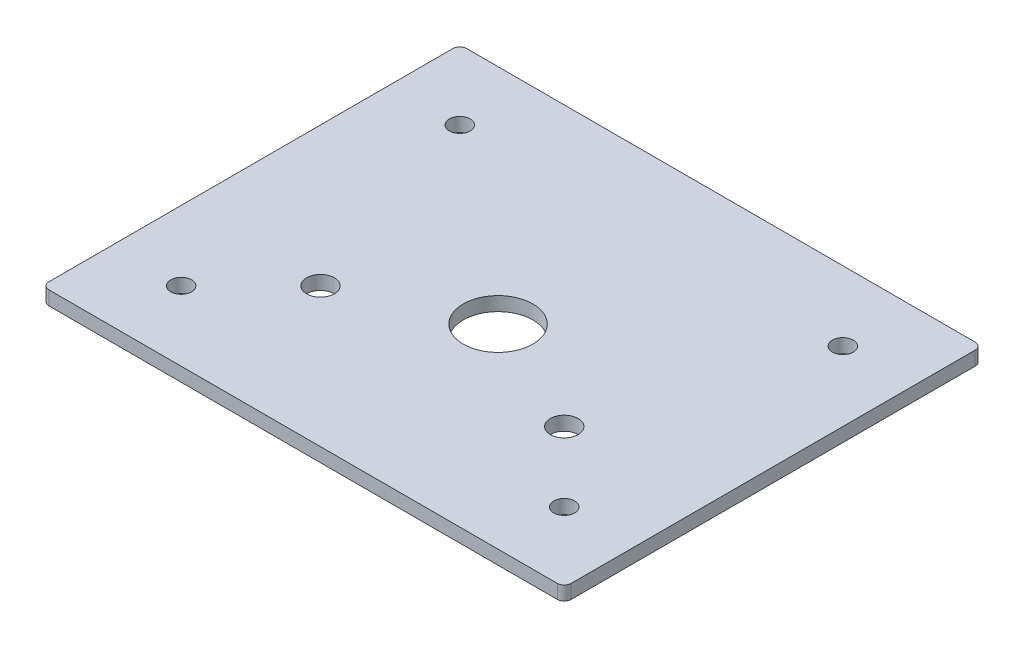
ISO-10303-21;
HEADER;
FILE_DESCRIPTION(('STEP AP214'),'2;1');
FILE_NAME('part.step','',(''),(''),'','','');
FILE_SCHEMA(('AUTOMOTIVE_DESIGN { 1 0 10303 214 1 1 1 1 }'));
ENDSEC;
DATA;
#1=APPLICATION_CONTEXT('core data for automotive mechanical design processes');
#2=APPLICATION_PROTOCOL_DEFINITION('international standard','automotive_design',2000,#1);
#3=PRODUCT_CONTEXT('',#1,'mechanical');
#4=PRODUCT('Part','Part','',(#3));
#5=PRODUCT_RELATED_PRODUCT_CATEGORY('part','',(#4));
#6=PRODUCT_DEFINITION_FORMATION('','',#4);
#7=PRODUCT_DEFINITION_CONTEXT('part definition',#1,'design');
#8=PRODUCT_DEFINITION('design','',#6,#7);
#9=PRODUCT_DEFINITION_SHAPE('','',#8);
#10=(LENGTH_UNIT() NAMED_UNIT(*) SI_UNIT(.MILLI.,.METRE.));
#11=(NAMED_UNIT(*) PLANE_ANGLE_UNIT() SI_UNIT($,.RADIAN.));
#12=(NAMED_UNIT(*) SI_UNIT($,.STERADIAN.) SOLID_ANGLE_UNIT());
#13=UNCERTAINTY_MEASURE_WITH_UNIT(LENGTH_MEASURE(1.E-05),#10,'distance_accuracy_value','');
#14=(GEOMETRIC_REPRESENTATION_CONTEXT(3) GLOBAL_UNCERTAINTY_ASSIGNED_CONTEXT((#13)) GLOBAL_UNIT_ASSIGNED_CONTEXT((#10,
#11,#12)) REPRESENTATION_CONTEXT('',''));
#15=CARTESIAN_POINT('',(0.,0.,0.));
#16=DIRECTION('',(0.,0.,1.));
#17=DIRECTION('',(1.,0.,0.));
#18=AXIS2_PLACEMENT_3D('',#15,#16,#17);
#19=CARTESIAN_POINT('',(0.,2.,0.));
#20=DIRECTION('',(1.,0.,0.));
#21=DIRECTION('',(0.,0.,-1.));
#22=AXIS2_PLACEMENT_3D('',#19,#20,#21);
#23=PLANE('',#22);
#24=DIRECTION('',(0.,0.,1.));
#25=VECTOR('',#24,1.);
#26=CARTESIAN_POINT('',(0.,0.,0.));
#27=LINE('',#26,#25);
#28=CARTESIAN_POINT('',(0.,0.,-59.));
#29=VERTEX_POINT('',#28);
#30=CARTESIAN_POINT('',(0.,0.,-1.));
#31=VERTEX_POINT('',#30);
#32=EDGE_CURVE('E162',#29,#31,#27,.T.);
#33=ORIENTED_EDGE('',*,*,#32,.T.);
#34=DIRECTION('',(0.,-1.,0.));
#35=VECTOR('',#34,1.);
#36=CARTESIAN_POINT('',(0.,2.,-1.));
#37=LINE('',#36,#35);
#38=CARTESIAN_POINT('',(0.,2.,-1.));
#39=VERTEX_POINT('',#38);
#40=EDGE_CURVE('E11',#31,#39,#37,.F.);
#41=ORIENTED_EDGE('',*,*,#40,.T.);
#42=DIRECTION('',(0.,0.,1.));
#43=VECTOR('',#42,1.);
#44=CARTESIAN_POINT('',(0.,2.,0.));
#45=LINE('',#44,#43);
#46=CARTESIAN_POINT('',(0.,2.,-59.));
#47=VERTEX_POINT('',#46);
#48=EDGE_CURVE('E125',#47,#39,#45,.T.);
#49=ORIENTED_EDGE('',*,*,#48,.F.);
#50=DIRECTION('',(0.,-1.,0.));
#51=VECTOR('',#50,1.);
#52=CARTESIAN_POINT('',(0.,2.,-59.));
#53=LINE('',#52,#51);
#54=EDGE_CURVE('E41',#47,#29,#53,.T.);
#55=ORIENTED_EDGE('',*,*,#54,.T.);
#56=EDGE_LOOP('',(#33,#41,#49,#55));
#57=FACE_BOUND('',#56,.T.);
#58=ADVANCED_FACE('F33',(#57),#23,.F.);
#59=CARTESIAN_POINT('',(0.,2.,0.));
#60=DIRECTION('',(0.,0.,-1.));
#61=DIRECTION('',(-1.,0.,0.));
#62=AXIS2_PLACEMENT_3D('',#59,#60,#61);
#63=PLANE('',#62);
#64=DIRECTION('',(1.,0.,0.));
#65=VECTOR('',#64,1.);
#66=CARTESIAN_POINT('',(0.,0.,0.));
#67=LINE('',#66,#65);
#68=CARTESIAN_POINT('',(1.,0.,0.));
#69=VERTEX_POINT('',#68);
#70=CARTESIAN_POINT('',(74.,0.,0.));
#71=VERTEX_POINT('',#70);
#72=EDGE_CURVE('E130',#69,#71,#67,.T.);
#73=ORIENTED_EDGE('',*,*,#72,.T.);
#74=DIRECTION('',(0.,-1.,0.));
#75=VECTOR('',#74,1.);
#76=CARTESIAN_POINT('',(74.,2.,0.));
#77=LINE('',#76,#75);
#78=CARTESIAN_POINT('',(74.,2.,0.));
#79=VERTEX_POINT('',#78);
#80=EDGE_CURVE('E48',#71,#79,#77,.F.);
#81=ORIENTED_EDGE('',*,*,#80,.T.);
#82=DIRECTION('',(1.,0.,0.));
#83=VECTOR('',#82,1.);
#84=CARTESIAN_POINT('',(0.,2.,0.));
#85=LINE('',#84,#83);
#86=CARTESIAN_POINT('',(1.,2.,0.));
#87=VERTEX_POINT('',#86);
#88=EDGE_CURVE('E128',#87,#79,#85,.T.);
#89=ORIENTED_EDGE('',*,*,#88,.F.);
#90=DIRECTION('',(0.,-1.,0.));
#91=VECTOR('',#90,1.);
#92=CARTESIAN_POINT('',(1.,2.,0.));
#93=LINE('',#92,#91);
#94=EDGE_CURVE('E154',#87,#69,#93,.T.);
#95=ORIENTED_EDGE('',*,*,#94,.T.);
#96=EDGE_LOOP('',(#73,#81,#89,#95));
#97=FACE_BOUND('',#96,.T.);
#98=ADVANCED_FACE('F236',(#97),#63,.F.);
#99=CARTESIAN_POINT('',(75.,2.,0.));
#100=DIRECTION('',(-1.,0.,0.));
#101=DIRECTION('',(0.,0.,1.));
#102=AXIS2_PLACEMENT_3D('',#99,#100,#101);
#103=PLANE('',#102);
#104=DIRECTION('',(0.,0.,-1.));
#105=VECTOR('',#104,1.);
#106=CARTESIAN_POINT('',(75.,0.,0.));
#107=LINE('',#106,#105);
#108=CARTESIAN_POINT('',(75.,0.,-1.));
#109=VERTEX_POINT('',#108);
#110=CARTESIAN_POINT('',(75.,0.,-59.));
#111=VERTEX_POINT('',#110);
#112=EDGE_CURVE('E126',#109,#111,#107,.T.);
#113=ORIENTED_EDGE('',*,*,#112,.T.);
#114=DIRECTION('',(0.,-1.,0.));
#115=VECTOR('',#114,1.);
#116=CARTESIAN_POINT('',(75.,2.,-59.));
#117=LINE('',#116,#115);
#118=CARTESIAN_POINT('',(75.,2.,-59.));
#119=VERTEX_POINT('',#118);
#120=EDGE_CURVE('E104',#111,#119,#117,.F.);
#121=ORIENTED_EDGE('',*,*,#120,.T.);
#122=DIRECTION('',(0.,0.,-1.));
#123=VECTOR('',#122,1.);
#124=CARTESIAN_POINT('',(75.,2.,0.));
#125=LINE('',#124,#123);
#126=CARTESIAN_POINT('',(75.,2.,-1.));
#127=VERTEX_POINT('',#126);
#128=EDGE_CURVE('E174',#127,#119,#125,.T.);
#129=ORIENTED_EDGE('',*,*,#128,.F.);
#130=DIRECTION('',(0.,-1.,0.));
#131=VECTOR('',#130,1.);
#132=CARTESIAN_POINT('',(75.,2.,-1.));
#133=LINE('',#132,#131);
#134=EDGE_CURVE('E109',#127,#109,#133,.T.);
#135=ORIENTED_EDGE('',*,*,#134,.T.);
#136=EDGE_LOOP('',(#113,#121,#129,#135));
#137=FACE_BOUND('',#136,.T.);
#138=ADVANCED_FACE('F233',(#137),#103,.F.);
#139=CARTESIAN_POINT('',(0.,2.,-60.));
#140=DIRECTION('',(0.,0.,1.));
#141=DIRECTION('',(1.,0.,0.));
#142=AXIS2_PLACEMENT_3D('',#139,#140,#141);
#143=PLANE('',#142);
#144=DIRECTION('',(-1.,0.,0.));
#145=VECTOR('',#144,1.);
#146=CARTESIAN_POINT('',(0.,2.,-60.));
#147=LINE('',#146,#145);
#148=CARTESIAN_POINT('',(74.,2.,-60.));
#149=VERTEX_POINT('',#148);
#150=CARTESIAN_POINT('',(1.,2.,-60.));
#151=VERTEX_POINT('',#150);
#152=EDGE_CURVE('E119',#149,#151,#147,.T.);
#153=ORIENTED_EDGE('',*,*,#152,.F.);
#154=DIRECTION('',(0.,-1.,0.));
#155=VECTOR('',#154,1.);
#156=CARTESIAN_POINT('',(74.,2.,-60.));
#157=LINE('',#156,#155);
#158=CARTESIAN_POINT('',(74.,0.,-60.));
#159=VERTEX_POINT('',#158);
#160=EDGE_CURVE('E103',#149,#159,#157,.T.);
#161=ORIENTED_EDGE('',*,*,#160,.T.);
#162=DIRECTION('',(-1.,0.,0.));
#163=VECTOR('',#162,1.);
#164=CARTESIAN_POINT('',(0.,0.,-60.));
#165=LINE('',#164,#163);
#166=CARTESIAN_POINT('',(1.,0.,-60.));
#167=VERTEX_POINT('',#166);
#168=EDGE_CURVE('E116',#159,#167,#165,.T.);
#169=ORIENTED_EDGE('',*,*,#168,.T.);
#170=DIRECTION('',(0.,-1.,0.));
#171=VECTOR('',#170,1.);
#172=CARTESIAN_POINT('',(1.,2.,-60.));
#173=LINE('',#172,#171);
#174=EDGE_CURVE('E121',#167,#151,#173,.F.);
#175=ORIENTED_EDGE('',*,*,#174,.T.);
#176=EDGE_LOOP('',(#153,#161,#169,#175));
#177=FACE_BOUND('',#176,.T.);
#178=ADVANCED_FACE('F115',(#177),#143,.F.);
#179=CARTESIAN_POINT('',(0.,2.,0.));
#180=DIRECTION('',(0.,-1.,0.));
#181=DIRECTION('',(0.,0.,-1.));
#182=AXIS2_PLACEMENT_3D('',#179,#180,#181);
#183=PLANE('',#182);
#184=CARTESIAN_POINT('',(37.5,2.,-28.));
#185=DIRECTION('',(0.,1.,0.));
#186=DIRECTION('',(0.,0.,1.));
#187=AXIS2_PLACEMENT_3D('',#184,#185,#186);
#188=CIRCLE('',#187,5.);
#189=CARTESIAN_POINT('',(37.5,2.,-23.));
#190=VERTEX_POINT('',#189);
#191=EDGE_CURVE('E138',#190,#190,#188,.T.);
#192=ORIENTED_EDGE('',*,*,#191,.F.);
#193=EDGE_LOOP('',(#192));
#194=FACE_BOUND('',#193,.T.);
#195=CARTESIAN_POINT('',(20.,2.,-20.));
#196=DIRECTION('',(0.,1.,0.));
#197=DIRECTION('',(0.,0.,1.));
#198=AXIS2_PLACEMENT_3D('',#195,#196,#197);
#199=CIRCLE('',#198,2.);
#200=CARTESIAN_POINT('',(20.,2.,-18.));
#201=VERTEX_POINT('',#200);
#202=EDGE_CURVE('E196',#201,#201,#199,.T.);
#203=ORIENTED_EDGE('',*,*,#202,.F.);
#204=EDGE_LOOP('',(#203));
#205=FACE_BOUND('',#204,.T.);
#206=CARTESIAN_POINT('',(65.,2.,-50.));
#207=DIRECTION('',(0.,1.,0.));
#208=DIRECTION('',(0.,0.,1.));
#209=AXIS2_PLACEMENT_3D('',#206,#207,#208);
#210=CIRCLE('',#209,1.5);
#211=CARTESIAN_POINT('',(65.,2.,-48.5));
#212=VERTEX_POINT('',#211);
#213=EDGE_CURVE('E185',#212,#212,#210,.T.);
#214=ORIENTED_EDGE('',*,*,#213,.F.);
#215=EDGE_LOOP('',(#214));
#216=FACE_BOUND('',#215,.T.);
#217=CARTESIAN_POINT('',(10.,2.,-50.));
#218=DIRECTION('',(0.,1.,0.));
#219=DIRECTION('',(0.,0.,1.));
#220=AXIS2_PLACEMENT_3D('',#217,#218,#219);
#221=CIRCLE('',#220,1.5);
#222=CARTESIAN_POINT('',(10.,2.,-48.5));
#223=VERTEX_POINT('',#222);
#224=EDGE_CURVE('E184',#223,#223,#221,.T.);
#225=ORIENTED_EDGE('',*,*,#224,.F.);
#226=EDGE_LOOP('',(#225));
#227=FACE_BOUND('',#226,.T.);
#228=CARTESIAN_POINT('',(65.,2.,-10.));
#229=DIRECTION('',(0.,1.,0.));
#230=DIRECTION('',(0.,0.,1.));
#231=AXIS2_PLACEMENT_3D('',#228,#229,#230);
#232=CIRCLE('',#231,1.5);
#233=CARTESIAN_POINT('',(65.,2.,-8.5));
#234=VERTEX_POINT('',#233);
#235=EDGE_CURVE('E179',#234,#234,#232,.T.);
#236=ORIENTED_EDGE('',*,*,#235,.F.);
#237=EDGE_LOOP('',(#236));
#238=FACE_BOUND('',#237,.T.);
#239=CARTESIAN_POINT('',(55.,2.,-20.));
#240=DIRECTION('',(0.,1.,0.));
#241=DIRECTION('',(0.,0.,1.));
#242=AXIS2_PLACEMENT_3D('',#239,#240,#241);
#243=CIRCLE('',#242,2.);
#244=CARTESIAN_POINT('',(55.,2.,-18.));
#245=VERTEX_POINT('',#244);
#246=EDGE_CURVE('E197',#245,#245,#243,.T.);
#247=ORIENTED_EDGE('',*,*,#246,.F.);
#248=EDGE_LOOP('',(#247));
#249=FACE_BOUND('',#248,.T.);
#250=CARTESIAN_POINT('',(10.,2.,-10.));
#251=DIRECTION('',(0.,1.,0.));
#252=DIRECTION('',(0.,0.,1.));
#253=AXIS2_PLACEMENT_3D('',#250,#251,#252);
#254=CIRCLE('',#253,1.5);
#255=CARTESIAN_POINT('',(10.,2.,-8.5));
#256=VERTEX_POINT('',#255);
#257=EDGE_CURVE('E170',#256,#256,#254,.T.);
#258=ORIENTED_EDGE('',*,*,#257,.F.);
#259=EDGE_LOOP('',(#258));
#260=FACE_BOUND('',#259,.T.);
#261=ORIENTED_EDGE('',*,*,#128,.T.);
#262=CARTESIAN_POINT('',(74.,2.,-59.));
#263=DIRECTION('',(0.,-1.,0.));
#264=DIRECTION('',(0.,0.,-1.));
#265=AXIS2_PLACEMENT_3D('',#262,#263,#264);
#266=CIRCLE('',#265,1.);
#267=EDGE_CURVE('E152',#119,#149,#266,.F.);
#268=ORIENTED_EDGE('',*,*,#267,.T.);
#269=ORIENTED_EDGE('',*,*,#152,.T.);
#270=CARTESIAN_POINT('',(1.,2.,-59.));
#271=DIRECTION('',(0.,-1.,0.));
#272=DIRECTION('',(0.,0.,-1.));
#273=AXIS2_PLACEMENT_3D('',#270,#271,#272);
#274=CIRCLE('',#273,1.);
#275=EDGE_CURVE('E147',#151,#47,#274,.F.);
#276=ORIENTED_EDGE('',*,*,#275,.T.);
#277=ORIENTED_EDGE('',*,*,#48,.T.);
#278=CARTESIAN_POINT('',(1.,2.,-1.));
#279=DIRECTION('',(0.,-1.,0.));
#280=DIRECTION('',(0.,0.,-1.));
#281=AXIS2_PLACEMENT_3D('',#278,#279,#280);
#282=CIRCLE('',#281,1.);
#283=EDGE_CURVE('E55',#39,#87,#282,.F.);
#284=ORIENTED_EDGE('',*,*,#283,.T.);
#285=ORIENTED_EDGE('',*,*,#88,.T.);
#286=CARTESIAN_POINT('',(74.,2.,-1.));
#287=DIRECTION('',(0.,-1.,0.));
#288=DIRECTION('',(0.,0.,-1.));
#289=AXIS2_PLACEMENT_3D('',#286,#287,#288);
#290=CIRCLE('',#289,1.);
#291=EDGE_CURVE('E150',#79,#127,#290,.F.);
#292=ORIENTED_EDGE('',*,*,#291,.T.);
#293=EDGE_LOOP('',(#261,#268,#269,#276,#277,#284,#285,#292));
#294=FACE_BOUND('',#293,.T.);
#295=ADVANCED_FACE('F214',(#194,#205,#216,#227,#238,#249,#260,#294),#183,.F.);
#296=CARTESIAN_POINT('',(0.,0.,0.));
#297=DIRECTION('',(0.,-1.,0.));
#298=DIRECTION('',(0.,0.,-1.));
#299=AXIS2_PLACEMENT_3D('',#296,#297,#298);
#300=PLANE('',#299);
#301=CARTESIAN_POINT('',(37.5,0.,-28.));
#302=DIRECTION('',(0.,-1.,0.));
#303=DIRECTION('',(0.,0.,-1.));
#304=AXIS2_PLACEMENT_3D('',#301,#302,#303);
#305=CIRCLE('',#304,5.);
#306=CARTESIAN_POINT('',(37.5,0.,-33.));
#307=VERTEX_POINT('',#306);
#308=EDGE_CURVE('E134',#307,#307,#305,.T.);
#309=ORIENTED_EDGE('',*,*,#308,.F.);
#310=EDGE_LOOP('',(#309));
#311=FACE_BOUND('',#310,.T.);
#312=CARTESIAN_POINT('',(20.,0.,-20.));
#313=DIRECTION('',(0.,1.,0.));
#314=DIRECTION('',(0.,0.,1.));
#315=AXIS2_PLACEMENT_3D('',#312,#313,#314);
#316=CIRCLE('',#315,2.);
#317=CARTESIAN_POINT('',(20.,0.,-18.));
#318=VERTEX_POINT('',#317);
#319=EDGE_CURVE('E193',#318,#318,#316,.T.);
#320=ORIENTED_EDGE('',*,*,#319,.T.);
#321=EDGE_LOOP('',(#320));
#322=FACE_BOUND('',#321,.T.);
#323=CARTESIAN_POINT('',(65.,0.,-50.));
#324=DIRECTION('',(0.,1.,0.));
#325=DIRECTION('',(0.,0.,1.));
#326=AXIS2_PLACEMENT_3D('',#323,#324,#325);
#327=CIRCLE('',#326,1.5);
#328=CARTESIAN_POINT('',(65.,0.,-48.5));
#329=VERTEX_POINT('',#328);
#330=EDGE_CURVE('E200',#329,#329,#327,.T.);
#331=ORIENTED_EDGE('',*,*,#330,.T.);
#332=EDGE_LOOP('',(#331));
#333=FACE_BOUND('',#332,.T.);
#334=CARTESIAN_POINT('',(10.,0.,-50.));
#335=DIRECTION('',(0.,1.,0.));
#336=DIRECTION('',(0.,0.,1.));
#337=AXIS2_PLACEMENT_3D('',#334,#335,#336);
#338=CIRCLE('',#337,1.5);
#339=CARTESIAN_POINT('',(10.,0.,-48.5));
#340=VERTEX_POINT('',#339);
#341=EDGE_CURVE('E181',#340,#340,#338,.T.);
#342=ORIENTED_EDGE('',*,*,#341,.T.);
#343=EDGE_LOOP('',(#342));
#344=FACE_BOUND('',#343,.T.);
#345=CARTESIAN_POINT('',(65.,0.,-10.));
#346=DIRECTION('',(0.,1.,0.));
#347=DIRECTION('',(0.,0.,1.));
#348=AXIS2_PLACEMENT_3D('',#345,#346,#347);
#349=CIRCLE('',#348,1.5);
#350=CARTESIAN_POINT('',(65.,0.,-8.5));
#351=VERTEX_POINT('',#350);
#352=EDGE_CURVE('E188',#351,#351,#349,.T.);
#353=ORIENTED_EDGE('',*,*,#352,.T.);
#354=EDGE_LOOP('',(#353));
#355=FACE_BOUND('',#354,.T.);
#356=CARTESIAN_POINT('',(55.,0.,-20.));
#357=DIRECTION('',(0.,1.,0.));
#358=DIRECTION('',(0.,0.,1.));
#359=AXIS2_PLACEMENT_3D('',#356,#357,#358);
#360=CIRCLE('',#359,2.);
#361=CARTESIAN_POINT('',(55.,0.,-18.));
#362=VERTEX_POINT('',#361);
#363=EDGE_CURVE('E137',#362,#362,#360,.T.);
#364=ORIENTED_EDGE('',*,*,#363,.T.);
#365=EDGE_LOOP('',(#364));
#366=FACE_BOUND('',#365,.T.);
#367=CARTESIAN_POINT('',(10.,0.,-10.));
#368=DIRECTION('',(0.,1.,0.));
#369=DIRECTION('',(0.,0.,1.));
#370=AXIS2_PLACEMENT_3D('',#367,#368,#369);
#371=CIRCLE('',#370,1.5);
#372=CARTESIAN_POINT('',(10.,0.,-8.5));
#373=VERTEX_POINT('',#372);
#374=EDGE_CURVE('E167',#373,#373,#371,.T.);
#375=ORIENTED_EDGE('',*,*,#374,.T.);
#376=EDGE_LOOP('',(#375));
#377=FACE_BOUND('',#376,.T.);
#378=ORIENTED_EDGE('',*,*,#168,.F.);
#379=CARTESIAN_POINT('',(74.,0.,-59.));
#380=DIRECTION('',(0.,-1.,0.));
#381=DIRECTION('',(0.,0.,-1.));
#382=AXIS2_PLACEMENT_3D('',#379,#380,#381);
#383=CIRCLE('',#382,1.);
#384=EDGE_CURVE('E99',#159,#111,#383,.T.);
#385=ORIENTED_EDGE('',*,*,#384,.T.);
#386=ORIENTED_EDGE('',*,*,#112,.F.);
#387=CARTESIAN_POINT('',(74.,0.,-1.));
#388=DIRECTION('',(0.,-1.,0.));
#389=DIRECTION('',(0.,0.,-1.));
#390=AXIS2_PLACEMENT_3D('',#387,#388,#389);
#391=CIRCLE('',#390,1.);
#392=EDGE_CURVE('E110',#109,#71,#391,.T.);
#393=ORIENTED_EDGE('',*,*,#392,.T.);
#394=ORIENTED_EDGE('',*,*,#72,.F.);
#395=CARTESIAN_POINT('',(1.,0.,-1.));
#396=DIRECTION('',(0.,-1.,0.));
#397=DIRECTION('',(0.,0.,-1.));
#398=AXIS2_PLACEMENT_3D('',#395,#396,#397);
#399=CIRCLE('',#398,1.);
#400=EDGE_CURVE('E141',#69,#31,#399,.T.);
#401=ORIENTED_EDGE('',*,*,#400,.T.);
#402=ORIENTED_EDGE('',*,*,#32,.F.);
#403=CARTESIAN_POINT('',(1.,0.,-59.));
#404=DIRECTION('',(0.,-1.,0.));
#405=DIRECTION('',(0.,0.,-1.));
#406=AXIS2_PLACEMENT_3D('',#403,#404,#405);
#407=CIRCLE('',#406,1.);
#408=EDGE_CURVE('E120',#29,#167,#407,.T.);
#409=ORIENTED_EDGE('',*,*,#408,.T.);
#410=EDGE_LOOP('',(#378,#385,#386,#393,#394,#401,#402,#409));
#411=FACE_BOUND('',#410,.T.);
#412=ADVANCED_FACE('F123',(#311,#322,#333,#344,#355,#366,#377,#411),#300,.T.);
#413=CARTESIAN_POINT('',(10.,0.,-10.));
#414=DIRECTION('',(0.,1.,0.));
#415=DIRECTION('',(0.,0.,1.));
#416=AXIS2_PLACEMENT_3D('',#413,#414,#415);
#417=CYLINDRICAL_SURFACE('',#416,1.5);
#418=ORIENTED_EDGE('',*,*,#374,.F.);
#419=EDGE_LOOP('',(#418));
#420=FACE_BOUND('',#419,.T.);
#421=ORIENTED_EDGE('',*,*,#257,.T.);
#422=EDGE_LOOP('',(#421));
#423=FACE_BOUND('',#422,.T.);
#424=ADVANCED_FACE('F329',(#420,#423),#417,.F.);
#425=CARTESIAN_POINT('',(55.,0.,-20.));
#426=DIRECTION('',(0.,1.,0.));
#427=DIRECTION('',(0.,0.,1.));
#428=AXIS2_PLACEMENT_3D('',#425,#426,#427);
#429=CYLINDRICAL_SURFACE('',#428,2.);
#430=ORIENTED_EDGE('',*,*,#363,.F.);
#431=EDGE_LOOP('',(#430));
#432=FACE_BOUND('',#431,.T.);
#433=ORIENTED_EDGE('',*,*,#246,.T.);
#434=EDGE_LOOP('',(#433));
#435=FACE_BOUND('',#434,.T.);
#436=ADVANCED_FACE('F320',(#432,#435),#429,.F.);
#437=CARTESIAN_POINT('',(65.,0.,-10.));
#438=DIRECTION('',(0.,1.,0.));
#439=DIRECTION('',(0.,0.,1.));
#440=AXIS2_PLACEMENT_3D('',#437,#438,#439);
#441=CYLINDRICAL_SURFACE('',#440,1.5);
#442=ORIENTED_EDGE('',*,*,#352,.F.);
#443=EDGE_LOOP('',(#442));
#444=FACE_BOUND('',#443,.T.);
#445=ORIENTED_EDGE('',*,*,#235,.T.);
#446=EDGE_LOOP('',(#445));
#447=FACE_BOUND('',#446,.T.);
#448=ADVANCED_FACE('F311',(#444,#447),#441,.F.);
#449=CARTESIAN_POINT('',(10.,0.,-50.));
#450=DIRECTION('',(0.,1.,0.));
#451=DIRECTION('',(0.,0.,1.));
#452=AXIS2_PLACEMENT_3D('',#449,#450,#451);
#453=CYLINDRICAL_SURFACE('',#452,1.5);
#454=ORIENTED_EDGE('',*,*,#341,.F.);
#455=EDGE_LOOP('',(#454));
#456=FACE_BOUND('',#455,.T.);
#457=ORIENTED_EDGE('',*,*,#224,.T.);
#458=EDGE_LOOP('',(#457));
#459=FACE_BOUND('',#458,.T.);
#460=ADVANCED_FACE('F302',(#456,#459),#453,.F.);
#461=CARTESIAN_POINT('',(65.,0.,-50.));
#462=DIRECTION('',(0.,1.,0.));
#463=DIRECTION('',(0.,0.,1.));
#464=AXIS2_PLACEMENT_3D('',#461,#462,#463);
#465=CYLINDRICAL_SURFACE('',#464,1.5);
#466=ORIENTED_EDGE('',*,*,#330,.F.);
#467=EDGE_LOOP('',(#466));
#468=FACE_BOUND('',#467,.T.);
#469=ORIENTED_EDGE('',*,*,#213,.T.);
#470=EDGE_LOOP('',(#469));
#471=FACE_BOUND('',#470,.T.);
#472=ADVANCED_FACE('F293',(#468,#471),#465,.F.);
#473=CARTESIAN_POINT('',(20.,0.,-20.));
#474=DIRECTION('',(0.,1.,0.));
#475=DIRECTION('',(0.,0.,1.));
#476=AXIS2_PLACEMENT_3D('',#473,#474,#475);
#477=CYLINDRICAL_SURFACE('',#476,2.);
#478=ORIENTED_EDGE('',*,*,#319,.F.);
#479=EDGE_LOOP('',(#478));
#480=FACE_BOUND('',#479,.T.);
#481=ORIENTED_EDGE('',*,*,#202,.T.);
#482=EDGE_LOOP('',(#481));
#483=FACE_BOUND('',#482,.T.);
#484=ADVANCED_FACE('F284',(#480,#483),#477,.F.);
#485=CARTESIAN_POINT('',(37.5,-38.,-28.));
#486=DIRECTION('',(0.,1.,0.));
#487=DIRECTION('',(0.,0.,1.));
#488=AXIS2_PLACEMENT_3D('',#485,#486,#487);
#489=CYLINDRICAL_SURFACE('',#488,5.);
#490=ORIENTED_EDGE('',*,*,#308,.T.);
#491=EDGE_LOOP('',(#490));
#492=FACE_BOUND('',#491,.T.);
#493=ORIENTED_EDGE('',*,*,#191,.T.);
#494=EDGE_LOOP('',(#493));
#495=FACE_BOUND('',#494,.T.);
#496=ADVANCED_FACE('F212',(#492,#495),#489,.F.);
#497=CARTESIAN_POINT('',(74.,2.,-59.));
#498=DIRECTION('',(0.,-1.,0.));
#499=DIRECTION('',(0.,0.,-1.));
#500=AXIS2_PLACEMENT_3D('',#497,#498,#499);
#501=CYLINDRICAL_SURFACE('',#500,1.);
#502=ORIENTED_EDGE('',*,*,#267,.F.);
#503=ORIENTED_EDGE('',*,*,#120,.F.);
#504=ORIENTED_EDGE('',*,*,#384,.F.);
#505=ORIENTED_EDGE('',*,*,#160,.F.);
#506=EDGE_LOOP('',(#502,#503,#504,#505));
#507=FACE_BOUND('',#506,.T.);
#508=ADVANCED_FACE('F102',(#507),#501,.T.);
#509=CARTESIAN_POINT('',(74.,2.,-1.));
#510=DIRECTION('',(0.,-1.,0.));
#511=DIRECTION('',(0.,0.,-1.));
#512=AXIS2_PLACEMENT_3D('',#509,#510,#511);
#513=CYLINDRICAL_SURFACE('',#512,1.);
#514=ORIENTED_EDGE('',*,*,#291,.F.);
#515=ORIENTED_EDGE('',*,*,#80,.F.);
#516=ORIENTED_EDGE('',*,*,#392,.F.);
#517=ORIENTED_EDGE('',*,*,#134,.F.);
#518=EDGE_LOOP('',(#514,#515,#516,#517));
#519=FACE_BOUND('',#518,.T.);
#520=ADVANCED_FACE('F235',(#519),#513,.T.);
#521=CARTESIAN_POINT('',(1.,2.,-1.));
#522=DIRECTION('',(0.,-1.,0.));
#523=DIRECTION('',(0.,0.,-1.));
#524=AXIS2_PLACEMENT_3D('',#521,#522,#523);
#525=CYLINDRICAL_SURFACE('',#524,1.);
#526=ORIENTED_EDGE('',*,*,#283,.F.);
#527=ORIENTED_EDGE('',*,*,#40,.F.);
#528=ORIENTED_EDGE('',*,*,#400,.F.);
#529=ORIENTED_EDGE('',*,*,#94,.F.);
#530=EDGE_LOOP('',(#526,#527,#528,#529));
#531=FACE_BOUND('',#530,.T.);
#532=ADVANCED_FACE('F239',(#531),#525,.T.);
#533=CARTESIAN_POINT('',(1.,2.,-59.));
#534=DIRECTION('',(0.,-1.,0.));
#535=DIRECTION('',(0.,0.,-1.));
#536=AXIS2_PLACEMENT_3D('',#533,#534,#535);
#537=CYLINDRICAL_SURFACE('',#536,1.);
#538=ORIENTED_EDGE('',*,*,#275,.F.);
#539=ORIENTED_EDGE('',*,*,#174,.F.);
#540=ORIENTED_EDGE('',*,*,#408,.F.);
#541=ORIENTED_EDGE('',*,*,#54,.F.);
#542=EDGE_LOOP('',(#538,#539,#540,#541));
#543=FACE_BOUND('',#542,.T.);
#544=ADVANCED_FACE('F35',(#543),#537,.T.);
#545=CLOSED_SHELL('',(#58,#98,#138,#178,#295,#412,#424,#436,#448,#460,#472,#484,#496,#508,#520,
#532,#544));
#546=MANIFOLD_SOLID_BREP('B2',#545);
#547=ADVANCED_BREP_SHAPE_REPRESENTATION('',(#18,#546),#14);
#548=SHAPE_DEFINITION_REPRESENTATION(#9,#547);
ENDSEC;
END-ISO-10303-21;
